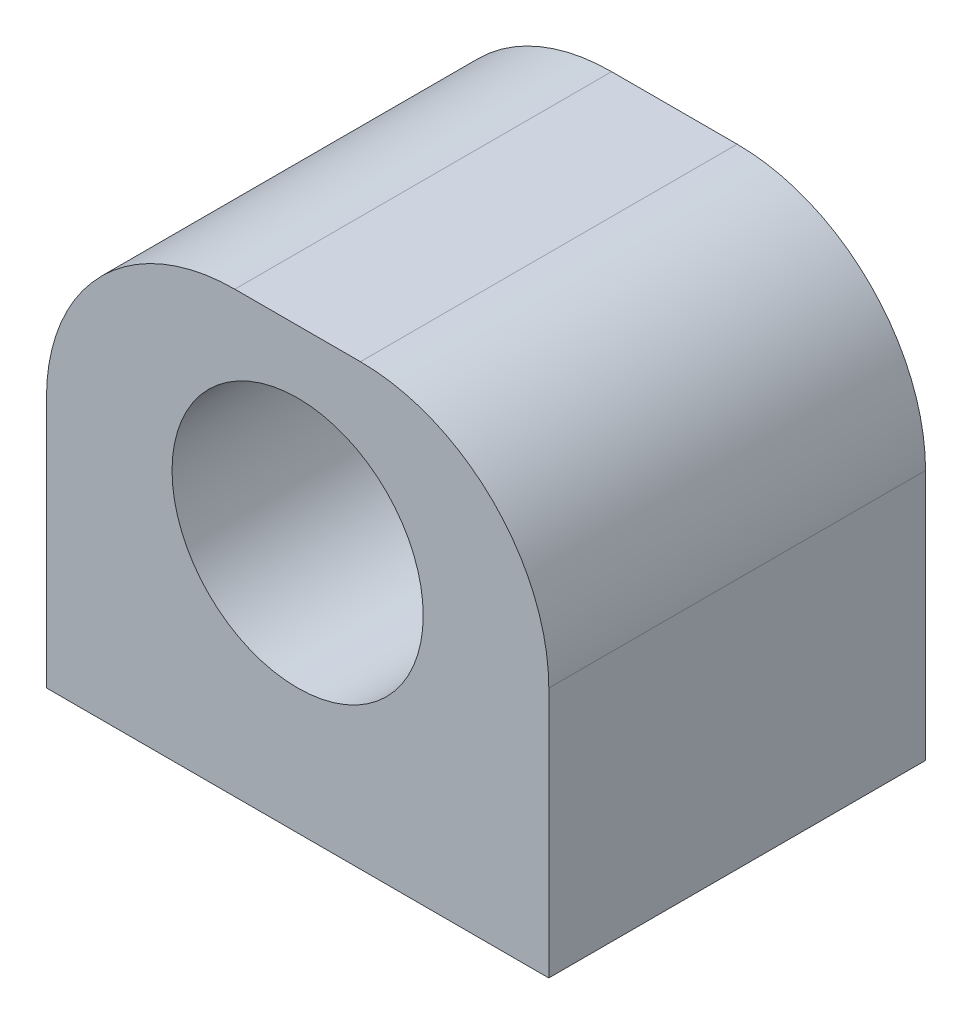
ISO-10303-21;
HEADER;
FILE_DESCRIPTION(('STEP AP214'),'2;1');
FILE_NAME('part.step','',(''),(''),'','','');
FILE_SCHEMA(('AUTOMOTIVE_DESIGN { 1 0 10303 214 1 1 1 1 }'));
ENDSEC;
DATA;
#1=APPLICATION_CONTEXT('core data for automotive mechanical design processes');
#2=APPLICATION_PROTOCOL_DEFINITION('international standard','automotive_design',2000,#1);
#3=PRODUCT_CONTEXT('',#1,'mechanical');
#4=PRODUCT('Part','Part','',(#3));
#5=PRODUCT_RELATED_PRODUCT_CATEGORY('part','',(#4));
#6=PRODUCT_DEFINITION_FORMATION('','',#4);
#7=PRODUCT_DEFINITION_CONTEXT('part definition',#1,'design');
#8=PRODUCT_DEFINITION('design','',#6,#7);
#9=PRODUCT_DEFINITION_SHAPE('','',#8);
#10=(LENGTH_UNIT() NAMED_UNIT(*) SI_UNIT(.MILLI.,.METRE.));
#11=(NAMED_UNIT(*) PLANE_ANGLE_UNIT() SI_UNIT($,.RADIAN.));
#12=(NAMED_UNIT(*) SI_UNIT($,.STERADIAN.) SOLID_ANGLE_UNIT());
#13=UNCERTAINTY_MEASURE_WITH_UNIT(LENGTH_MEASURE(1.E-05),#10,'distance_accuracy_value','');
#14=(GEOMETRIC_REPRESENTATION_CONTEXT(3) GLOBAL_UNCERTAINTY_ASSIGNED_CONTEXT((#13)) GLOBAL_UNIT_ASSIGNED_CONTEXT((#10,
#11,#12)) REPRESENTATION_CONTEXT('',''));
#15=CARTESIAN_POINT('',(0.,0.,0.));
#16=DIRECTION('',(0.,0.,1.));
#17=DIRECTION('',(1.,0.,0.));
#18=AXIS2_PLACEMENT_3D('',#15,#16,#17);
#19=CARTESIAN_POINT('',(-15.,20.,0.));
#20=DIRECTION('',(0.,1.,0.));
#21=DIRECTION('',(0.,0.,1.));
#22=AXIS2_PLACEMENT_3D('',#19,#20,#21);
#23=PLANE('',#22);
#24=CARTESIAN_POINT('',(-15.,20.,0.));
#25=DIRECTION('',(0.,-1.,0.));
#26=DIRECTION('',(0.,0.,-1.));
#27=AXIS2_PLACEMENT_3D('',#24,#25,#26);
#28=CIRCLE('',#27,1.64999999999999);
#29=CARTESIAN_POINT('',(-15.,20.,-1.64999999999999));
#30=VERTEX_POINT('',#29);
#31=EDGE_CURVE('E20',#30,#30,#28,.T.);
#32=ORIENTED_EDGE('',*,*,#31,.T.);
#33=EDGE_LOOP('',(#32));
#34=FACE_BOUND('',#33,.T.);
#35=ADVANCED_FACE('F17',(#34),#23,.F.);
#36=CARTESIAN_POINT('',(15.,20.,0.));
#37=DIRECTION('',(0.,1.,0.));
#38=DIRECTION('',(0.,0.,1.));
#39=AXIS2_PLACEMENT_3D('',#36,#37,#38);
#40=PLANE('',#39);
#41=CARTESIAN_POINT('',(15.,20.,0.));
#42=DIRECTION('',(0.,-1.,0.));
#43=DIRECTION('',(0.,0.,-1.));
#44=AXIS2_PLACEMENT_3D('',#41,#42,#43);
#45=CIRCLE('',#44,1.64999999999999);
#46=CARTESIAN_POINT('',(15.,20.,-1.64999999999999));
#47=VERTEX_POINT('',#46);
#48=EDGE_CURVE('E92',#47,#47,#45,.T.);
#49=ORIENTED_EDGE('',*,*,#48,.T.);
#50=EDGE_LOOP('',(#49));
#51=FACE_BOUND('',#50,.T.);
#52=ADVANCED_FACE('F273',(#51),#40,.F.);
#53=CARTESIAN_POINT('',(-5.,20.,15.));
#54=DIRECTION('',(0.,0.,-1.));
#55=DIRECTION('',(-1.,0.,0.));
#56=AXIS2_PLACEMENT_3D('',#53,#54,#55);
#57=CYLINDRICAL_SURFACE('',#56,15.);
#58=CARTESIAN_POINT('',(-5.,20.,15.));
#59=DIRECTION('',(0.,0.,-1.));
#60=DIRECTION('',(-1.,0.,0.));
#61=AXIS2_PLACEMENT_3D('',#58,#59,#60);
#62=CIRCLE('',#61,15.);
#63=CARTESIAN_POINT('',(-20.,19.9999999999999,15.));
#64=VERTEX_POINT('',#63);
#65=CARTESIAN_POINT('',(-4.99999999999995,35.,15.));
#66=VERTEX_POINT('',#65);
#67=EDGE_CURVE('E66',#64,#66,#62,.T.);
#68=ORIENTED_EDGE('',*,*,#67,.T.);
#69=DIRECTION('',(0.,0.,-1.));
#70=VECTOR('',#69,1.);
#71=CARTESIAN_POINT('',(-4.9999999999999,35.,15.));
#72=LINE('',#71,#70);
#73=CARTESIAN_POINT('',(-4.99999999999995,35.,-15.));
#74=VERTEX_POINT('',#73);
#75=EDGE_CURVE('E73',#66,#74,#72,.T.);
#76=ORIENTED_EDGE('',*,*,#75,.T.);
#77=CARTESIAN_POINT('',(-5.,20.,-15.));
#78=DIRECTION('',(0.,0.,-1.));
#79=DIRECTION('',(-1.,0.,0.));
#80=AXIS2_PLACEMENT_3D('',#77,#78,#79);
#81=CIRCLE('',#80,15.);
#82=CARTESIAN_POINT('',(-20.,19.9999999999999,-15.));
#83=VERTEX_POINT('',#82);
#84=EDGE_CURVE('E135',#83,#74,#81,.T.);
#85=ORIENTED_EDGE('',*,*,#84,.F.);
#86=DIRECTION('',(0.,0.,-1.));
#87=VECTOR('',#86,1.);
#88=CARTESIAN_POINT('',(-20.,19.9999999999999,15.));
#89=LINE('',#88,#87);
#90=EDGE_CURVE('E89',#83,#64,#89,.F.);
#91=ORIENTED_EDGE('',*,*,#90,.T.);
#92=EDGE_LOOP('',(#68,#76,#85,#91));
#93=FACE_BOUND('',#92,.T.);
#94=ADVANCED_FACE('F88',(#93),#57,.T.);
#95=CARTESIAN_POINT('',(-4.9999999999999,35.,15.));
#96=DIRECTION('',(0.,-1.,0.));
#97=DIRECTION('',(0.,0.,-1.));
#98=AXIS2_PLACEMENT_3D('',#95,#96,#97);
#99=PLANE('',#98);
#100=ORIENTED_EDGE('',*,*,#75,.F.);
#101=DIRECTION('',(-1.,0.,0.));
#102=VECTOR('',#101,1.);
#103=CARTESIAN_POINT('',(-5.,35.,15.));
#104=LINE('',#103,#102);
#105=CARTESIAN_POINT('',(4.99999999999995,35.,15.));
#106=VERTEX_POINT('',#105);
#107=EDGE_CURVE('E76',#66,#106,#104,.F.);
#108=ORIENTED_EDGE('',*,*,#107,.T.);
#109=DIRECTION('',(0.,0.,-1.));
#110=VECTOR('',#109,1.);
#111=CARTESIAN_POINT('',(4.9999999999999,35.,15.));
#112=LINE('',#111,#110);
#113=CARTESIAN_POINT('',(4.99999999999995,35.,-15.));
#114=VERTEX_POINT('',#113);
#115=EDGE_CURVE('E80',#114,#106,#112,.F.);
#116=ORIENTED_EDGE('',*,*,#115,.F.);
#117=DIRECTION('',(-1.,0.,0.));
#118=VECTOR('',#117,1.);
#119=CARTESIAN_POINT('',(-5.,35.,-15.));
#120=LINE('',#119,#118);
#121=EDGE_CURVE('E77',#74,#114,#120,.F.);
#122=ORIENTED_EDGE('',*,*,#121,.F.);
#123=EDGE_LOOP('',(#100,#108,#116,#122));
#124=FACE_BOUND('',#123,.T.);
#125=ADVANCED_FACE('F74',(#124),#99,.F.);
#126=CARTESIAN_POINT('',(5.,20.,15.));
#127=DIRECTION('',(0.,0.,-1.));
#128=DIRECTION('',(-1.,0.,0.));
#129=AXIS2_PLACEMENT_3D('',#126,#127,#128);
#130=CYLINDRICAL_SURFACE('',#129,15.);
#131=CARTESIAN_POINT('',(5.,20.,15.));
#132=DIRECTION('',(0.,0.,-1.));
#133=DIRECTION('',(-1.,0.,0.));
#134=AXIS2_PLACEMENT_3D('',#131,#132,#133);
#135=CIRCLE('',#134,15.);
#136=CARTESIAN_POINT('',(20.,20.,15.));
#137=VERTEX_POINT('',#136);
#138=EDGE_CURVE('E86',#106,#137,#135,.T.);
#139=ORIENTED_EDGE('',*,*,#138,.T.);
#140=DIRECTION('',(0.,0.,1.));
#141=VECTOR('',#140,1.);
#142=CARTESIAN_POINT('',(20.,19.9999999999999,15.));
#143=LINE('',#142,#141);
#144=CARTESIAN_POINT('',(20.,20.,-15.));
#145=VERTEX_POINT('',#144);
#146=EDGE_CURVE('E118',#137,#145,#143,.F.);
#147=ORIENTED_EDGE('',*,*,#146,.T.);
#148=CARTESIAN_POINT('',(5.,20.,-15.));
#149=DIRECTION('',(0.,0.,-1.));
#150=DIRECTION('',(-1.,0.,0.));
#151=AXIS2_PLACEMENT_3D('',#148,#149,#150);
#152=CIRCLE('',#151,15.);
#153=EDGE_CURVE('E133',#114,#145,#152,.T.);
#154=ORIENTED_EDGE('',*,*,#153,.F.);
#155=ORIENTED_EDGE('',*,*,#115,.T.);
#156=EDGE_LOOP('',(#139,#147,#154,#155));
#157=FACE_BOUND('',#156,.T.);
#158=ADVANCED_FACE('F168',(#157),#130,.T.);
#159=CARTESIAN_POINT('',(0.,20.,15.));
#160=DIRECTION('',(0.,0.,-1.));
#161=DIRECTION('',(-1.,0.,0.));
#162=AXIS2_PLACEMENT_3D('',#159,#160,#161);
#163=CYLINDRICAL_SURFACE('',#162,10.);
#164=CARTESIAN_POINT('',(0.,20.,15.));
#165=DIRECTION('',(0.,0.,-1.));
#166=DIRECTION('',(-1.,0.,0.));
#167=AXIS2_PLACEMENT_3D('',#164,#165,#166);
#168=CIRCLE('',#167,10.);
#169=CARTESIAN_POINT('',(-10.,20.,15.));
#170=VERTEX_POINT('',#169);
#171=EDGE_CURVE('E119',#170,#170,#168,.F.);
#172=ORIENTED_EDGE('',*,*,#171,.T.);
#173=EDGE_LOOP('',(#172));
#174=FACE_BOUND('',#173,.T.);
#175=CARTESIAN_POINT('',(0.,20.,-15.));
#176=DIRECTION('',(0.,0.,-1.));
#177=DIRECTION('',(-1.,0.,0.));
#178=AXIS2_PLACEMENT_3D('',#175,#176,#177);
#179=CIRCLE('',#178,10.);
#180=CARTESIAN_POINT('',(-10.,20.,-15.));
#181=VERTEX_POINT('',#180);
#182=EDGE_CURVE('E130',#181,#181,#179,.F.);
#183=ORIENTED_EDGE('',*,*,#182,.F.);
#184=EDGE_LOOP('',(#183));
#185=FACE_BOUND('',#184,.T.);
#186=ADVANCED_FACE('F170',(#174,#185),#163,.F.);
#187=CARTESIAN_POINT('',(-15.,0.,0.));
#188=DIRECTION('',(0.,-1.,0.));
#189=DIRECTION('',(0.,0.,-1.));
#190=AXIS2_PLACEMENT_3D('',#187,#188,#189);
#191=CYLINDRICAL_SURFACE('',#190,1.64999999999999);
#192=ORIENTED_EDGE('',*,*,#31,.F.);
#193=EDGE_LOOP('',(#192));
#194=FACE_BOUND('',#193,.T.);
#195=CARTESIAN_POINT('',(-15.,0.,0.));
#196=DIRECTION('',(0.,-1.,0.));
#197=DIRECTION('',(0.,0.,-1.));
#198=AXIS2_PLACEMENT_3D('',#195,#196,#197);
#199=CIRCLE('',#198,1.64999999999999);
#200=CARTESIAN_POINT('',(-15.,0.,-1.64999999999999));
#201=VERTEX_POINT('',#200);
#202=EDGE_CURVE('E127',#201,#201,#199,.T.);
#203=ORIENTED_EDGE('',*,*,#202,.T.);
#204=EDGE_LOOP('',(#203));
#205=FACE_BOUND('',#204,.T.);
#206=ADVANCED_FACE('F177',(#194,#205),#191,.F.);
#207=CARTESIAN_POINT('',(15.,0.,0.));
#208=DIRECTION('',(0.,-1.,0.));
#209=DIRECTION('',(0.,0.,-1.));
#210=AXIS2_PLACEMENT_3D('',#207,#208,#209);
#211=CYLINDRICAL_SURFACE('',#210,1.64999999999999);
#212=ORIENTED_EDGE('',*,*,#48,.F.);
#213=EDGE_LOOP('',(#212));
#214=FACE_BOUND('',#213,.T.);
#215=CARTESIAN_POINT('',(15.,0.,0.));
#216=DIRECTION('',(0.,-1.,0.));
#217=DIRECTION('',(0.,0.,-1.));
#218=AXIS2_PLACEMENT_3D('',#215,#216,#217);
#219=CIRCLE('',#218,1.64999999999999);
#220=CARTESIAN_POINT('',(15.,0.,-1.64999999999999));
#221=VERTEX_POINT('',#220);
#222=EDGE_CURVE('E113',#221,#221,#219,.T.);
#223=ORIENTED_EDGE('',*,*,#222,.T.);
#224=EDGE_LOOP('',(#223));
#225=FACE_BOUND('',#224,.T.);
#226=ADVANCED_FACE('F196',(#214,#225),#211,.F.);
#227=CARTESIAN_POINT('',(-20.,0.,15.));
#228=DIRECTION('',(1.,0.,0.));
#229=DIRECTION('',(0.,0.,-1.));
#230=AXIS2_PLACEMENT_3D('',#227,#228,#229);
#231=PLANE('',#230);
#232=DIRECTION('',(0.,0.,1.));
#233=VECTOR('',#232,1.);
#234=CARTESIAN_POINT('',(-20.,0.,15.));
#235=LINE('',#234,#233);
#236=CARTESIAN_POINT('',(-20.,0.,-15.));
#237=VERTEX_POINT('',#236);
#238=CARTESIAN_POINT('',(-20.,0.,15.));
#239=VERTEX_POINT('',#238);
#240=EDGE_CURVE('E109',#237,#239,#235,.T.);
#241=ORIENTED_EDGE('',*,*,#240,.T.);
#242=DIRECTION('',(0.,1.,0.));
#243=VECTOR('',#242,1.);
#244=CARTESIAN_POINT('',(-20.,20.,15.));
#245=LINE('',#244,#243);
#246=EDGE_CURVE('E138',#239,#64,#245,.T.);
#247=ORIENTED_EDGE('',*,*,#246,.T.);
#248=ORIENTED_EDGE('',*,*,#90,.F.);
#249=DIRECTION('',(0.,1.,0.));
#250=VECTOR('',#249,1.);
#251=CARTESIAN_POINT('',(-20.,20.,-15.));
#252=LINE('',#251,#250);
#253=EDGE_CURVE('E136',#237,#83,#252,.T.);
#254=ORIENTED_EDGE('',*,*,#253,.F.);
#255=EDGE_LOOP('',(#241,#247,#248,#254));
#256=FACE_BOUND('',#255,.T.);
#257=ADVANCED_FACE('F192',(#256),#231,.F.);
#258=CARTESIAN_POINT('',(-5.,20.,15.));
#259=DIRECTION('',(0.,0.,-1.));
#260=DIRECTION('',(-1.,0.,0.));
#261=AXIS2_PLACEMENT_3D('',#258,#259,#260);
#262=PLANE('',#261);
#263=ORIENTED_EDGE('',*,*,#171,.F.);
#264=EDGE_LOOP('',(#263));
#265=FACE_BOUND('',#264,.T.);
#266=DIRECTION('',(1.,0.,0.));
#267=VECTOR('',#266,1.);
#268=CARTESIAN_POINT('',(-20.,0.,15.));
#269=LINE('',#268,#267);
#270=CARTESIAN_POINT('',(20.,0.,15.));
#271=VERTEX_POINT('',#270);
#272=EDGE_CURVE('E112',#239,#271,#269,.T.);
#273=ORIENTED_EDGE('',*,*,#272,.T.);
#274=DIRECTION('',(0.,1.,0.));
#275=VECTOR('',#274,1.);
#276=CARTESIAN_POINT('',(20.,0.,15.));
#277=LINE('',#276,#275);
#278=EDGE_CURVE('E116',#271,#137,#277,.T.);
#279=ORIENTED_EDGE('',*,*,#278,.T.);
#280=ORIENTED_EDGE('',*,*,#138,.F.);
#281=ORIENTED_EDGE('',*,*,#107,.F.);
#282=ORIENTED_EDGE('',*,*,#67,.F.);
#283=ORIENTED_EDGE('',*,*,#246,.F.);
#284=EDGE_LOOP('',(#273,#279,#280,#281,#282,#283));
#285=FACE_BOUND('',#284,.T.);
#286=ADVANCED_FACE('F84',(#265,#285),#262,.F.);
#287=CARTESIAN_POINT('',(20.,0.,15.));
#288=DIRECTION('',(-1.,0.,0.));
#289=DIRECTION('',(0.,0.,1.));
#290=AXIS2_PLACEMENT_3D('',#287,#288,#289);
#291=PLANE('',#290);
#292=ORIENTED_EDGE('',*,*,#146,.F.);
#293=ORIENTED_EDGE('',*,*,#278,.F.);
#294=DIRECTION('',(0.,0.,1.));
#295=VECTOR('',#294,1.);
#296=CARTESIAN_POINT('',(20.,0.,15.));
#297=LINE('',#296,#295);
#298=CARTESIAN_POINT('',(20.,0.,-15.));
#299=VERTEX_POINT('',#298);
#300=EDGE_CURVE('E26',#271,#299,#297,.F.);
#301=ORIENTED_EDGE('',*,*,#300,.T.);
#302=DIRECTION('',(0.,1.,0.));
#303=VECTOR('',#302,1.);
#304=CARTESIAN_POINT('',(20.,20.,-15.));
#305=LINE('',#304,#303);
#306=EDGE_CURVE('E34',#145,#299,#305,.F.);
#307=ORIENTED_EDGE('',*,*,#306,.F.);
#308=EDGE_LOOP('',(#292,#293,#301,#307));
#309=FACE_BOUND('',#308,.T.);
#310=ADVANCED_FACE('F156',(#309),#291,.F.);
#311=CARTESIAN_POINT('',(-5.,20.,-15.));
#312=DIRECTION('',(0.,0.,-1.));
#313=DIRECTION('',(-1.,0.,0.));
#314=AXIS2_PLACEMENT_3D('',#311,#312,#313);
#315=PLANE('',#314);
#316=ORIENTED_EDGE('',*,*,#182,.T.);
#317=EDGE_LOOP('',(#316));
#318=FACE_BOUND('',#317,.T.);
#319=ORIENTED_EDGE('',*,*,#306,.T.);
#320=DIRECTION('',(1.,0.,0.));
#321=VECTOR('',#320,1.);
#322=CARTESIAN_POINT('',(-20.,0.,-15.));
#323=LINE('',#322,#321);
#324=EDGE_CURVE('E11',#299,#237,#323,.F.);
#325=ORIENTED_EDGE('',*,*,#324,.T.);
#326=ORIENTED_EDGE('',*,*,#253,.T.);
#327=ORIENTED_EDGE('',*,*,#84,.T.);
#328=ORIENTED_EDGE('',*,*,#121,.T.);
#329=ORIENTED_EDGE('',*,*,#153,.T.);
#330=EDGE_LOOP('',(#319,#325,#326,#327,#328,#329));
#331=FACE_BOUND('',#330,.T.);
#332=ADVANCED_FACE('F163',(#318,#331),#315,.T.);
#333=CARTESIAN_POINT('',(-20.,0.,15.));
#334=DIRECTION('',(0.,1.,0.));
#335=DIRECTION('',(0.,0.,1.));
#336=AXIS2_PLACEMENT_3D('',#333,#334,#335);
#337=PLANE('',#336);
#338=ORIENTED_EDGE('',*,*,#300,.F.);
#339=ORIENTED_EDGE('',*,*,#272,.F.);
#340=ORIENTED_EDGE('',*,*,#240,.F.);
#341=ORIENTED_EDGE('',*,*,#324,.F.);
#342=EDGE_LOOP('',(#338,#339,#340,#341));
#343=FACE_BOUND('',#342,.T.);
#344=ORIENTED_EDGE('',*,*,#222,.F.);
#345=EDGE_LOOP('',(#344));
#346=FACE_BOUND('',#345,.T.);
#347=ORIENTED_EDGE('',*,*,#202,.F.);
#348=EDGE_LOOP('',(#347));
#349=FACE_BOUND('',#348,.T.);
#350=ADVANCED_FACE('F159',(#343,#346,#349),#337,.F.);
#351=CLOSED_SHELL('',(#35,#52,#94,#125,#158,#186,#206,#226,#257,#286,#310,#332,#350));
#352=MANIFOLD_SOLID_BREP('B1',#351);
#353=ADVANCED_BREP_SHAPE_REPRESENTATION('',(#18,#352),#14);
#354=SHAPE_DEFINITION_REPRESENTATION(#9,#353);
ENDSEC;
END-ISO-10303-21;
